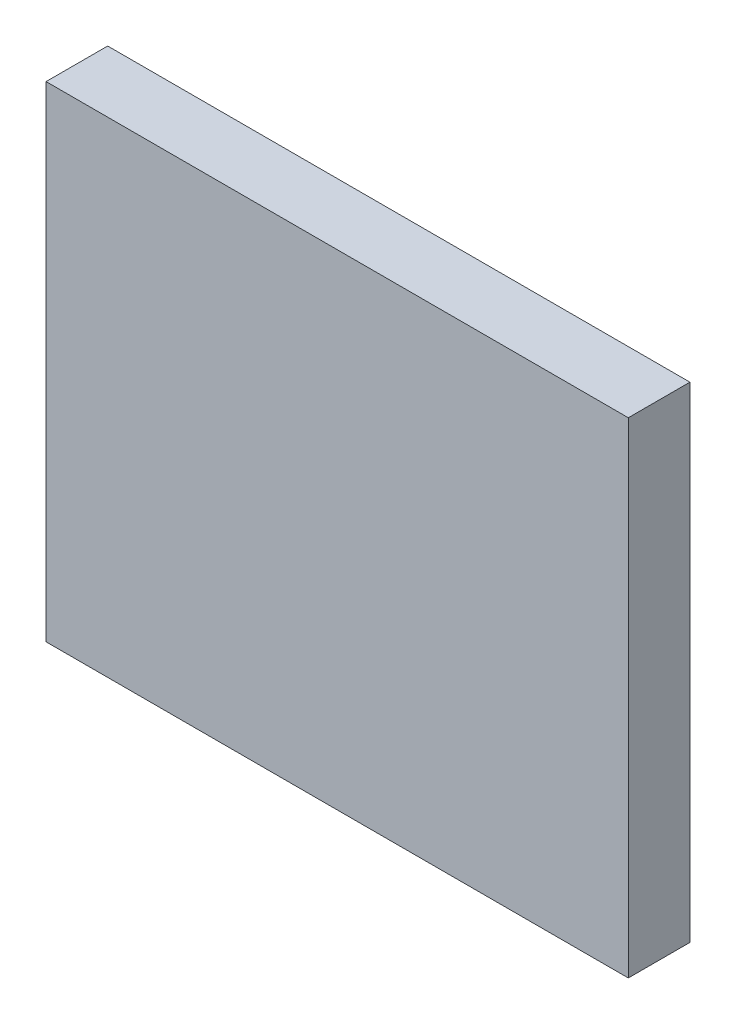
ISO-10303-21;
HEADER;
FILE_DESCRIPTION(('STEP AP214'),'2;1');
FILE_NAME('part.step','',(''),(''),'','','');
FILE_SCHEMA(('AUTOMOTIVE_DESIGN { 1 0 10303 214 1 1 1 1 }'));
ENDSEC;
DATA;
#1=APPLICATION_CONTEXT('core data for automotive mechanical design processes');
#2=APPLICATION_PROTOCOL_DEFINITION('international standard','automotive_design',2000,#1);
#3=PRODUCT_CONTEXT('',#1,'mechanical');
#4=PRODUCT('Part','Part','',(#3));
#5=PRODUCT_RELATED_PRODUCT_CATEGORY('part','',(#4));
#6=PRODUCT_DEFINITION_FORMATION('','',#4);
#7=PRODUCT_DEFINITION_CONTEXT('part definition',#1,'design');
#8=PRODUCT_DEFINITION('design','',#6,#7);
#9=PRODUCT_DEFINITION_SHAPE('','',#8);
#10=(LENGTH_UNIT() NAMED_UNIT(*) SI_UNIT(.MILLI.,.METRE.));
#11=(NAMED_UNIT(*) PLANE_ANGLE_UNIT() SI_UNIT($,.RADIAN.));
#12=(NAMED_UNIT(*) SI_UNIT($,.STERADIAN.) SOLID_ANGLE_UNIT());
#13=UNCERTAINTY_MEASURE_WITH_UNIT(LENGTH_MEASURE(1.E-05),#10,'distance_accuracy_value','');
#14=(GEOMETRIC_REPRESENTATION_CONTEXT(3) GLOBAL_UNCERTAINTY_ASSIGNED_CONTEXT((#13)) GLOBAL_UNIT_ASSIGNED_CONTEXT((#10,
#11,#12)) REPRESENTATION_CONTEXT('',''));
#15=CARTESIAN_POINT('',(0.,0.,0.));
#16=DIRECTION('',(0.,0.,1.));
#17=DIRECTION('',(1.,0.,0.));
#18=AXIS2_PLACEMENT_3D('',#15,#16,#17);
#19=CARTESIAN_POINT('',(-120.,-100.,25.4));
#20=DIRECTION('',(1.,0.,0.));
#21=DIRECTION('',(0.,0.,-1.));
#22=AXIS2_PLACEMENT_3D('',#19,#20,#21);
#23=PLANE('',#22);
#24=DIRECTION('',(0.,-1.,0.));
#25=VECTOR('',#24,1.);
#26=CARTESIAN_POINT('',(-120.,-100.,0.));
#27=LINE('',#26,#25);
#28=CARTESIAN_POINT('',(-120.,100.,0.));
#29=VERTEX_POINT('',#28);
#30=CARTESIAN_POINT('',(-120.,-100.,0.));
#31=VERTEX_POINT('',#30);
#32=EDGE_CURVE('E96',#29,#31,#27,.T.);
#33=ORIENTED_EDGE('',*,*,#32,.T.);
#34=DIRECTION('',(0.,0.,-1.));
#35=VECTOR('',#34,1.);
#36=CARTESIAN_POINT('',(-120.,-100.,25.4));
#37=LINE('',#36,#35);
#38=CARTESIAN_POINT('',(-120.,-100.,25.4));
#39=VERTEX_POINT('',#38);
#40=EDGE_CURVE('E11',#39,#31,#37,.T.);
#41=ORIENTED_EDGE('',*,*,#40,.F.);
#42=DIRECTION('',(0.,-1.,0.));
#43=VECTOR('',#42,1.);
#44=CARTESIAN_POINT('',(-120.,-100.,25.4));
#45=LINE('',#44,#43);
#46=CARTESIAN_POINT('',(-120.,100.,25.4));
#47=VERTEX_POINT('',#46);
#48=EDGE_CURVE('E84',#47,#39,#45,.T.);
#49=ORIENTED_EDGE('',*,*,#48,.F.);
#50=DIRECTION('',(0.,0.,-1.));
#51=VECTOR('',#50,1.);
#52=CARTESIAN_POINT('',(-120.,100.,25.4));
#53=LINE('',#52,#51);
#54=EDGE_CURVE('E92',#47,#29,#53,.T.);
#55=ORIENTED_EDGE('',*,*,#54,.T.);
#56=EDGE_LOOP('',(#33,#41,#49,#55));
#57=FACE_BOUND('',#56,.T.);
#58=ADVANCED_FACE('F33',(#57),#23,.F.);
#59=CARTESIAN_POINT('',(120.,-100.,25.4));
#60=DIRECTION('',(0.,1.,0.));
#61=DIRECTION('',(-1.,0.,0.));
#62=AXIS2_PLACEMENT_3D('',#59,#60,#61);
#63=PLANE('',#62);
#64=DIRECTION('',(1.,0.,0.));
#65=VECTOR('',#64,1.);
#66=CARTESIAN_POINT('',(120.,-100.,0.));
#67=LINE('',#66,#65);
#68=CARTESIAN_POINT('',(120.,-100.,0.));
#69=VERTEX_POINT('',#68);
#70=EDGE_CURVE('E88',#31,#69,#67,.T.);
#71=ORIENTED_EDGE('',*,*,#70,.T.);
#72=DIRECTION('',(0.,0.,-1.));
#73=VECTOR('',#72,1.);
#74=CARTESIAN_POINT('',(120.,-100.,25.4));
#75=LINE('',#74,#73);
#76=CARTESIAN_POINT('',(120.,-100.,25.4));
#77=VERTEX_POINT('',#76);
#78=EDGE_CURVE('E41',#77,#69,#75,.T.);
#79=ORIENTED_EDGE('',*,*,#78,.F.);
#80=DIRECTION('',(1.,0.,0.));
#81=VECTOR('',#80,1.);
#82=CARTESIAN_POINT('',(120.,-100.,25.4));
#83=LINE('',#82,#81);
#84=EDGE_CURVE('E79',#39,#77,#83,.T.);
#85=ORIENTED_EDGE('',*,*,#84,.F.);
#86=ORIENTED_EDGE('',*,*,#40,.T.);
#87=EDGE_LOOP('',(#71,#79,#85,#86));
#88=FACE_BOUND('',#87,.T.);
#89=ADVANCED_FACE('F87',(#88),#63,.F.);
#90=CARTESIAN_POINT('',(120.,-100.,25.4));
#91=DIRECTION('',(-1.,0.,0.));
#92=DIRECTION('',(0.,0.,1.));
#93=AXIS2_PLACEMENT_3D('',#90,#91,#92);
#94=PLANE('',#93);
#95=DIRECTION('',(0.,1.,0.));
#96=VECTOR('',#95,1.);
#97=CARTESIAN_POINT('',(120.,-100.,0.));
#98=LINE('',#97,#96);
#99=CARTESIAN_POINT('',(120.,100.,0.));
#100=VERTEX_POINT('',#99);
#101=EDGE_CURVE('E66',#69,#100,#98,.T.);
#102=ORIENTED_EDGE('',*,*,#101,.T.);
#103=DIRECTION('',(0.,0.,-1.));
#104=VECTOR('',#103,1.);
#105=CARTESIAN_POINT('',(120.,100.,25.4));
#106=LINE('',#105,#104);
#107=CARTESIAN_POINT('',(120.,100.,25.4));
#108=VERTEX_POINT('',#107);
#109=EDGE_CURVE('E89',#108,#100,#106,.T.);
#110=ORIENTED_EDGE('',*,*,#109,.F.);
#111=DIRECTION('',(0.,1.,0.));
#112=VECTOR('',#111,1.);
#113=CARTESIAN_POINT('',(120.,-100.,25.4));
#114=LINE('',#113,#112);
#115=EDGE_CURVE('E82',#77,#108,#114,.T.);
#116=ORIENTED_EDGE('',*,*,#115,.F.);
#117=ORIENTED_EDGE('',*,*,#78,.T.);
#118=EDGE_LOOP('',(#102,#110,#116,#117));
#119=FACE_BOUND('',#118,.T.);
#120=ADVANCED_FACE('F90',(#119),#94,.F.);
#121=CARTESIAN_POINT('',(120.,100.,25.4));
#122=DIRECTION('',(0.,-1.,0.));
#123=DIRECTION('',(1.,0.,0.));
#124=AXIS2_PLACEMENT_3D('',#121,#122,#123);
#125=PLANE('',#124);
#126=DIRECTION('',(-1.,0.,0.));
#127=VECTOR('',#126,1.);
#128=CARTESIAN_POINT('',(120.,100.,0.));
#129=LINE('',#128,#127);
#130=EDGE_CURVE('E72',#100,#29,#129,.T.);
#131=ORIENTED_EDGE('',*,*,#130,.T.);
#132=ORIENTED_EDGE('',*,*,#54,.F.);
#133=DIRECTION('',(-1.,0.,0.));
#134=VECTOR('',#133,1.);
#135=CARTESIAN_POINT('',(120.,100.,25.4));
#136=LINE('',#135,#134);
#137=EDGE_CURVE('E49',#108,#47,#136,.T.);
#138=ORIENTED_EDGE('',*,*,#137,.F.);
#139=ORIENTED_EDGE('',*,*,#109,.T.);
#140=EDGE_LOOP('',(#131,#132,#138,#139));
#141=FACE_BOUND('',#140,.T.);
#142=ADVANCED_FACE('F103',(#141),#125,.F.);
#143=CARTESIAN_POINT('',(0.,0.,25.4));
#144=DIRECTION('',(0.,0.,1.));
#145=DIRECTION('',(1.,0.,0.));
#146=AXIS2_PLACEMENT_3D('',#143,#144,#145);
#147=PLANE('',#146);
#148=ORIENTED_EDGE('',*,*,#48,.T.);
#149=ORIENTED_EDGE('',*,*,#84,.T.);
#150=ORIENTED_EDGE('',*,*,#115,.T.);
#151=ORIENTED_EDGE('',*,*,#137,.T.);
#152=EDGE_LOOP('',(#148,#149,#150,#151));
#153=FACE_BOUND('',#152,.T.);
#154=ADVANCED_FACE('F80',(#153),#147,.T.);
#155=CARTESIAN_POINT('',(0.,0.,0.));
#156=DIRECTION('',(0.,0.,1.));
#157=DIRECTION('',(1.,0.,0.));
#158=AXIS2_PLACEMENT_3D('',#155,#156,#157);
#159=PLANE('',#158);
#160=ORIENTED_EDGE('',*,*,#32,.F.);
#161=ORIENTED_EDGE('',*,*,#130,.F.);
#162=ORIENTED_EDGE('',*,*,#101,.F.);
#163=ORIENTED_EDGE('',*,*,#70,.F.);
#164=EDGE_LOOP('',(#160,#161,#162,#163));
#165=FACE_BOUND('',#164,.T.);
#166=ADVANCED_FACE('F106',(#165),#159,.F.);
#167=CLOSED_SHELL('',(#58,#89,#120,#142,#154,#166));
#168=MANIFOLD_SOLID_BREP('B2',#167);
#169=ADVANCED_BREP_SHAPE_REPRESENTATION('',(#18,#168),#14);
#170=SHAPE_DEFINITION_REPRESENTATION(#9,#169);
ENDSEC;
END-ISO-10303-21;
